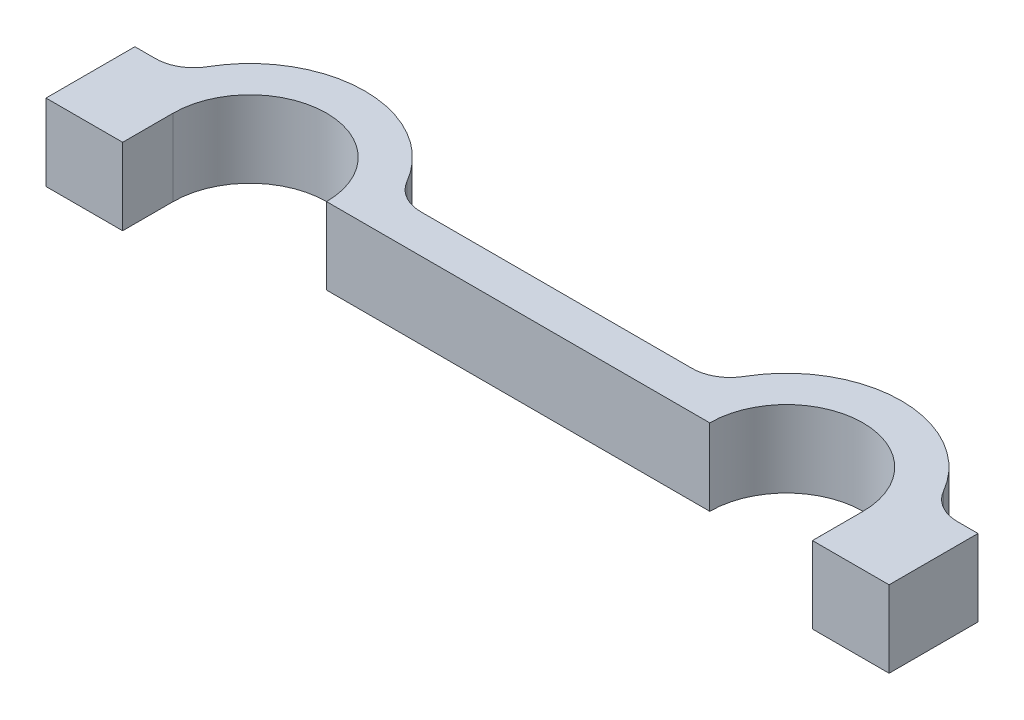
ISO-10303-21;
HEADER;
FILE_DESCRIPTION(('STEP AP214'),'2;1');
FILE_NAME('part.step','',(''),(''),'','','');
FILE_SCHEMA(('AUTOMOTIVE_DESIGN { 1 0 10303 214 1 1 1 1 }'));
ENDSEC;
DATA;
#1=APPLICATION_CONTEXT('core data for automotive mechanical design processes');
#2=APPLICATION_PROTOCOL_DEFINITION('international standard','automotive_design',2000,#1);
#3=PRODUCT_CONTEXT('',#1,'mechanical');
#4=PRODUCT('Part','Part','',(#3));
#5=PRODUCT_RELATED_PRODUCT_CATEGORY('part','',(#4));
#6=PRODUCT_DEFINITION_FORMATION('','',#4);
#7=PRODUCT_DEFINITION_CONTEXT('part definition',#1,'design');
#8=PRODUCT_DEFINITION('design','',#6,#7);
#9=PRODUCT_DEFINITION_SHAPE('','',#8);
#10=(LENGTH_UNIT() NAMED_UNIT(*) SI_UNIT(.MILLI.,.METRE.));
#11=(NAMED_UNIT(*) PLANE_ANGLE_UNIT() SI_UNIT($,.RADIAN.));
#12=(NAMED_UNIT(*) SI_UNIT($,.STERADIAN.) SOLID_ANGLE_UNIT());
#13=UNCERTAINTY_MEASURE_WITH_UNIT(LENGTH_MEASURE(1.E-05),#10,'distance_accuracy_value','');
#14=(GEOMETRIC_REPRESENTATION_CONTEXT(3) GLOBAL_UNCERTAINTY_ASSIGNED_CONTEXT((#13)) GLOBAL_UNIT_ASSIGNED_CONTEXT((#10,
#11,#12)) REPRESENTATION_CONTEXT('',''));
#15=CARTESIAN_POINT('',(0.,0.,0.));
#16=DIRECTION('',(0.,0.,1.));
#17=DIRECTION('',(1.,0.,0.));
#18=AXIS2_PLACEMENT_3D('',#15,#16,#17);
#19=CARTESIAN_POINT('',(12.7,12.7,0.));
#20=DIRECTION('',(0.,-1.,0.));
#21=DIRECTION('',(0.,0.,-1.));
#22=AXIS2_PLACEMENT_3D('',#19,#20,#21);
#23=CYLINDRICAL_SURFACE('',#22,12.7);
#24=CARTESIAN_POINT('',(12.7,0.,0.));
#25=DIRECTION('',(0.,-1.,0.));
#26=DIRECTION('',(0.,0.,-1.));
#27=AXIS2_PLACEMENT_3D('',#24,#25,#26);
#28=CIRCLE('',#27,12.7);
#29=CARTESIAN_POINT('',(0.,0.,0.));
#30=VERTEX_POINT('',#29);
#31=CARTESIAN_POINT('',(25.4,0.,0.));
#32=VERTEX_POINT('',#31);
#33=EDGE_CURVE('E178',#30,#32,#28,.T.);
#34=ORIENTED_EDGE('',*,*,#33,.T.);
#35=DIRECTION('',(0.,-1.,0.));
#36=VECTOR('',#35,1.);
#37=CARTESIAN_POINT('',(25.4,12.7,0.));
#38=LINE('',#37,#36);
#39=CARTESIAN_POINT('',(25.4,12.7,0.));
#40=VERTEX_POINT('',#39);
#41=EDGE_CURVE('E11',#40,#32,#38,.T.);
#42=ORIENTED_EDGE('',*,*,#41,.F.);
#43=CARTESIAN_POINT('',(12.7,12.7,0.));
#44=DIRECTION('',(0.,-1.,0.));
#45=DIRECTION('',(0.,0.,-1.));
#46=AXIS2_PLACEMENT_3D('',#43,#44,#45);
#47=CIRCLE('',#46,12.7);
#48=CARTESIAN_POINT('',(0.,12.7,0.));
#49=VERTEX_POINT('',#48);
#50=EDGE_CURVE('E56',#49,#40,#47,.T.);
#51=ORIENTED_EDGE('',*,*,#50,.F.);
#52=DIRECTION('',(0.,-1.,0.));
#53=VECTOR('',#52,1.);
#54=CARTESIAN_POINT('',(0.,12.7,0.));
#55=LINE('',#54,#53);
#56=EDGE_CURVE('E174',#49,#30,#55,.T.);
#57=ORIENTED_EDGE('',*,*,#56,.T.);
#58=EDGE_LOOP('',(#34,#42,#51,#57));
#59=FACE_BOUND('',#58,.T.);
#60=ADVANCED_FACE('F39',(#59),#23,.F.);
#61=CARTESIAN_POINT('',(25.4,12.7,0.));
#62=DIRECTION('',(0.,0.,-1.));
#63=DIRECTION('',(-1.,0.,0.));
#64=AXIS2_PLACEMENT_3D('',#61,#62,#63);
#65=PLANE('',#64);
#66=DIRECTION('',(1.,0.,0.));
#67=VECTOR('',#66,1.);
#68=CARTESIAN_POINT('',(25.4,0.,0.));
#69=LINE('',#68,#67);
#70=CARTESIAN_POINT('',(88.9,0.,0.));
#71=VERTEX_POINT('',#70);
#72=EDGE_CURVE('E182',#32,#71,#69,.T.);
#73=ORIENTED_EDGE('',*,*,#72,.T.);
#74=DIRECTION('',(0.,-1.,0.));
#75=VECTOR('',#74,1.);
#76=CARTESIAN_POINT('',(88.9,12.7,0.));
#77=LINE('',#76,#75);
#78=CARTESIAN_POINT('',(88.9,12.7,0.));
#79=VERTEX_POINT('',#78);
#80=EDGE_CURVE('E48',#79,#71,#77,.T.);
#81=ORIENTED_EDGE('',*,*,#80,.F.);
#82=DIRECTION('',(1.,0.,0.));
#83=VECTOR('',#82,1.);
#84=CARTESIAN_POINT('',(25.4,12.7,0.));
#85=LINE('',#84,#83);
#86=EDGE_CURVE('E117',#40,#79,#85,.T.);
#87=ORIENTED_EDGE('',*,*,#86,.F.);
#88=ORIENTED_EDGE('',*,*,#41,.T.);
#89=EDGE_LOOP('',(#73,#81,#87,#88));
#90=FACE_BOUND('',#89,.T.);
#91=ADVANCED_FACE('F379',(#90),#65,.F.);
#92=CARTESIAN_POINT('',(101.6,12.7,0.));
#93=DIRECTION('',(0.,-1.,0.));
#94=DIRECTION('',(0.,0.,-1.));
#95=AXIS2_PLACEMENT_3D('',#92,#93,#94);
#96=CYLINDRICAL_SURFACE('',#95,12.7);
#97=CARTESIAN_POINT('',(101.6,0.,0.));
#98=DIRECTION('',(0.,-1.,0.));
#99=DIRECTION('',(0.,0.,-1.));
#100=AXIS2_PLACEMENT_3D('',#97,#98,#99);
#101=CIRCLE('',#100,12.7);
#102=CARTESIAN_POINT('',(114.3,0.,0.));
#103=VERTEX_POINT('',#102);
#104=EDGE_CURVE('E186',#71,#103,#101,.T.);
#105=ORIENTED_EDGE('',*,*,#104,.T.);
#106=DIRECTION('',(0.,-1.,0.));
#107=VECTOR('',#106,1.);
#108=CARTESIAN_POINT('',(114.3,12.7,0.));
#109=LINE('',#108,#107);
#110=CARTESIAN_POINT('',(114.3,12.7,0.));
#111=VERTEX_POINT('',#110);
#112=EDGE_CURVE('E255',#111,#103,#109,.T.);
#113=ORIENTED_EDGE('',*,*,#112,.F.);
#114=CARTESIAN_POINT('',(101.6,12.7,0.));
#115=DIRECTION('',(0.,-1.,0.));
#116=DIRECTION('',(0.,0.,-1.));
#117=AXIS2_PLACEMENT_3D('',#114,#115,#116);
#118=CIRCLE('',#117,12.7);
#119=EDGE_CURVE('E266',#79,#111,#118,.T.);
#120=ORIENTED_EDGE('',*,*,#119,.F.);
#121=ORIENTED_EDGE('',*,*,#80,.T.);
#122=EDGE_LOOP('',(#105,#113,#120,#121));
#123=FACE_BOUND('',#122,.T.);
#124=ADVANCED_FACE('F263',(#123),#96,.F.);
#125=CARTESIAN_POINT('',(127.,12.7,0.));
#126=DIRECTION('',(-1.,0.,0.));
#127=DIRECTION('',(0.,0.,1.));
#128=AXIS2_PLACEMENT_3D('',#125,#126,#127);
#129=PLANE('',#128);
#130=DIRECTION('',(0.,0.,-1.));
#131=VECTOR('',#130,1.);
#132=CARTESIAN_POINT('',(127.,0.,0.));
#133=LINE('',#132,#131);
#134=CARTESIAN_POINT('',(127.,0.,8.382));
#135=VERTEX_POINT('',#134);
#136=CARTESIAN_POINT('',(127.,0.,-6.35));
#137=VERTEX_POINT('',#136);
#138=EDGE_CURVE('E189',#135,#137,#133,.T.);
#139=ORIENTED_EDGE('',*,*,#138,.T.);
#140=DIRECTION('',(0.,-1.,0.));
#141=VECTOR('',#140,1.);
#142=CARTESIAN_POINT('',(127.,12.7,-6.35));
#143=LINE('',#142,#141);
#144=CARTESIAN_POINT('',(127.,12.7,-6.35));
#145=VERTEX_POINT('',#144);
#146=EDGE_CURVE('E251',#145,#137,#143,.T.);
#147=ORIENTED_EDGE('',*,*,#146,.F.);
#148=DIRECTION('',(0.,0.,-1.));
#149=VECTOR('',#148,1.);
#150=CARTESIAN_POINT('',(127.,12.7,0.));
#151=LINE('',#150,#149);
#152=CARTESIAN_POINT('',(127.,12.7,8.382));
#153=VERTEX_POINT('',#152);
#154=EDGE_CURVE('E327',#153,#145,#151,.T.);
#155=ORIENTED_EDGE('',*,*,#154,.F.);
#156=DIRECTION('',(0.,1.,0.));
#157=VECTOR('',#156,1.);
#158=CARTESIAN_POINT('',(127.,0.,8.382));
#159=LINE('',#158,#157);
#160=EDGE_CURVE('E295',#135,#153,#159,.T.);
#161=ORIENTED_EDGE('',*,*,#160,.F.);
#162=EDGE_LOOP('',(#139,#147,#155,#161));
#163=FACE_BOUND('',#162,.T.);
#164=ADVANCED_FACE('F385',(#163),#129,.F.);
#165=CARTESIAN_POINT('',(123.597045256125,12.7,-6.35));
#166=DIRECTION('',(0.,0.,1.));
#167=DIRECTION('',(1.,0.,0.));
#168=AXIS2_PLACEMENT_3D('',#165,#166,#167);
#169=PLANE('',#168);
#170=DIRECTION('',(-1.,0.,0.));
#171=VECTOR('',#170,1.);
#172=CARTESIAN_POINT('',(123.597045256125,0.,-6.35));
#173=LINE('',#172,#171);
#174=CARTESIAN_POINT('',(123.597045256125,0.,-6.35));
#175=VERTEX_POINT('',#174);
#176=EDGE_CURVE('E192',#137,#175,#173,.T.);
#177=ORIENTED_EDGE('',*,*,#176,.T.);
#178=DIRECTION('',(0.,-1.,0.));
#179=VECTOR('',#178,1.);
#180=CARTESIAN_POINT('',(123.597045256125,12.7,-6.35));
#181=LINE('',#180,#179);
#182=CARTESIAN_POINT('',(123.597045256125,12.7,-6.35));
#183=VERTEX_POINT('',#182);
#184=EDGE_CURVE('E247',#183,#175,#181,.T.);
#185=ORIENTED_EDGE('',*,*,#184,.F.);
#186=DIRECTION('',(-1.,0.,0.));
#187=VECTOR('',#186,1.);
#188=CARTESIAN_POINT('',(123.597045256125,12.7,-6.35));
#189=LINE('',#188,#187);
#190=EDGE_CURVE('E330',#145,#183,#189,.T.);
#191=ORIENTED_EDGE('',*,*,#190,.F.);
#192=ORIENTED_EDGE('',*,*,#146,.T.);
#193=EDGE_LOOP('',(#177,#185,#191,#192));
#194=FACE_BOUND('',#193,.T.);
#195=ADVANCED_FACE('F390',(#194),#169,.F.);
#196=CARTESIAN_POINT('',(123.597045256125,12.7,-12.7));
#197=DIRECTION('',(0.,-1.,0.));
#198=DIRECTION('',(0.,0.,-1.));
#199=AXIS2_PLACEMENT_3D('',#196,#197,#198);
#200=CYLINDRICAL_SURFACE('',#199,6.35);
#201=CARTESIAN_POINT('',(123.597045256125,0.,-12.7));
#202=DIRECTION('',(0.,-1.,0.));
#203=DIRECTION('',(0.,0.,-1.));
#204=AXIS2_PLACEMENT_3D('',#201,#202,#203);
#205=CIRCLE('',#204,6.35);
#206=CARTESIAN_POINT('',(118.097783942094,0.,-9.52499999999999));
#207=VERTEX_POINT('',#206);
#208=EDGE_CURVE('E195',#175,#207,#205,.T.);
#209=ORIENTED_EDGE('',*,*,#208,.T.);
#210=DIRECTION('',(0.,-1.,0.));
#211=VECTOR('',#210,1.);
#212=CARTESIAN_POINT('',(118.097783942094,12.7,-9.52499999999999));
#213=LINE('',#212,#211);
#214=CARTESIAN_POINT('',(118.097783942094,12.7,-9.52499999999999));
#215=VERTEX_POINT('',#214);
#216=EDGE_CURVE('E243',#215,#207,#213,.T.);
#217=ORIENTED_EDGE('',*,*,#216,.F.);
#218=CARTESIAN_POINT('',(123.597045256125,12.7,-12.7));
#219=DIRECTION('',(0.,-1.,0.));
#220=DIRECTION('',(0.,0.,-1.));
#221=AXIS2_PLACEMENT_3D('',#218,#219,#220);
#222=CIRCLE('',#221,6.35);
#223=EDGE_CURVE('E333',#183,#215,#222,.T.);
#224=ORIENTED_EDGE('',*,*,#223,.F.);
#225=ORIENTED_EDGE('',*,*,#184,.T.);
#226=EDGE_LOOP('',(#209,#217,#224,#225));
#227=FACE_BOUND('',#226,.T.);
#228=ADVANCED_FACE('F394',(#227),#200,.F.);
#229=CARTESIAN_POINT('',(101.6,12.7,0.));
#230=DIRECTION('',(0.,-1.,0.));
#231=DIRECTION('',(0.,0.,-1.));
#232=AXIS2_PLACEMENT_3D('',#229,#230,#231);
#233=CYLINDRICAL_SURFACE('',#232,19.05);
#234=CARTESIAN_POINT('',(101.6,0.,0.));
#235=DIRECTION('',(0.,1.,0.));
#236=DIRECTION('',(0.,0.,-1.));
#237=AXIS2_PLACEMENT_3D('',#234,#235,#236);
#238=CIRCLE('',#237,19.05);
#239=CARTESIAN_POINT('',(85.1022160579064,0.,-9.525));
#240=VERTEX_POINT('',#239);
#241=EDGE_CURVE('E198',#207,#240,#238,.T.);
#242=ORIENTED_EDGE('',*,*,#241,.T.);
#243=DIRECTION('',(0.,-1.,0.));
#244=VECTOR('',#243,1.);
#245=CARTESIAN_POINT('',(85.1022160579064,12.7,-9.525));
#246=LINE('',#245,#244);
#247=CARTESIAN_POINT('',(85.1022160579064,12.7,-9.525));
#248=VERTEX_POINT('',#247);
#249=EDGE_CURVE('E239',#248,#240,#246,.T.);
#250=ORIENTED_EDGE('',*,*,#249,.F.);
#251=CARTESIAN_POINT('',(101.6,12.7,0.));
#252=DIRECTION('',(0.,1.,0.));
#253=DIRECTION('',(0.,0.,-1.));
#254=AXIS2_PLACEMENT_3D('',#251,#252,#253);
#255=CIRCLE('',#254,19.05);
#256=EDGE_CURVE('E336',#215,#248,#255,.T.);
#257=ORIENTED_EDGE('',*,*,#256,.F.);
#258=ORIENTED_EDGE('',*,*,#216,.T.);
#259=EDGE_LOOP('',(#242,#250,#257,#258));
#260=FACE_BOUND('',#259,.T.);
#261=ADVANCED_FACE('F398',(#260),#233,.T.);
#262=CARTESIAN_POINT('',(79.6029547438753,12.7,-12.7));
#263=DIRECTION('',(0.,-1.,0.));
#264=DIRECTION('',(0.,0.,-1.));
#265=AXIS2_PLACEMENT_3D('',#262,#263,#264);
#266=CYLINDRICAL_SURFACE('',#265,6.35);
#267=CARTESIAN_POINT('',(79.6029547438753,0.,-12.7));
#268=DIRECTION('',(0.,-1.,0.));
#269=DIRECTION('',(0.,0.,-1.));
#270=AXIS2_PLACEMENT_3D('',#267,#268,#269);
#271=CIRCLE('',#270,6.35);
#272=CARTESIAN_POINT('',(79.6029547438753,0.,-6.35));
#273=VERTEX_POINT('',#272);
#274=EDGE_CURVE('E201',#240,#273,#271,.T.);
#275=ORIENTED_EDGE('',*,*,#274,.T.);
#276=DIRECTION('',(0.,-1.,0.));
#277=VECTOR('',#276,1.);
#278=CARTESIAN_POINT('',(79.6029547438753,12.7,-6.35));
#279=LINE('',#278,#277);
#280=CARTESIAN_POINT('',(79.6029547438753,12.7,-6.35));
#281=VERTEX_POINT('',#280);
#282=EDGE_CURVE('E235',#281,#273,#279,.T.);
#283=ORIENTED_EDGE('',*,*,#282,.F.);
#284=CARTESIAN_POINT('',(79.6029547438753,12.7,-12.7));
#285=DIRECTION('',(0.,-1.,0.));
#286=DIRECTION('',(0.,0.,-1.));
#287=AXIS2_PLACEMENT_3D('',#284,#285,#286);
#288=CIRCLE('',#287,6.35);
#289=EDGE_CURVE('E339',#248,#281,#288,.T.);
#290=ORIENTED_EDGE('',*,*,#289,.F.);
#291=ORIENTED_EDGE('',*,*,#249,.T.);
#292=EDGE_LOOP('',(#275,#283,#290,#291));
#293=FACE_BOUND('',#292,.T.);
#294=ADVANCED_FACE('F402',(#293),#266,.F.);
#295=CARTESIAN_POINT('',(34.6970452561247,12.7,-6.35));
#296=DIRECTION('',(0.,0.,1.));
#297=DIRECTION('',(1.,0.,0.));
#298=AXIS2_PLACEMENT_3D('',#295,#296,#297);
#299=PLANE('',#298);
#300=DIRECTION('',(-1.,0.,0.));
#301=VECTOR('',#300,1.);
#302=CARTESIAN_POINT('',(34.6970452561247,0.,-6.35));
#303=LINE('',#302,#301);
#304=CARTESIAN_POINT('',(34.6970452561247,0.,-6.35));
#305=VERTEX_POINT('',#304);
#306=EDGE_CURVE('E204',#273,#305,#303,.T.);
#307=ORIENTED_EDGE('',*,*,#306,.T.);
#308=DIRECTION('',(0.,-1.,0.));
#309=VECTOR('',#308,1.);
#310=CARTESIAN_POINT('',(34.6970452561247,12.7,-6.35));
#311=LINE('',#310,#309);
#312=CARTESIAN_POINT('',(34.6970452561247,12.7,-6.35));
#313=VERTEX_POINT('',#312);
#314=EDGE_CURVE('E231',#313,#305,#311,.T.);
#315=ORIENTED_EDGE('',*,*,#314,.F.);
#316=DIRECTION('',(-1.,0.,0.));
#317=VECTOR('',#316,1.);
#318=CARTESIAN_POINT('',(34.6970452561247,12.7,-6.35));
#319=LINE('',#318,#317);
#320=EDGE_CURVE('E342',#281,#313,#319,.T.);
#321=ORIENTED_EDGE('',*,*,#320,.F.);
#322=ORIENTED_EDGE('',*,*,#282,.T.);
#323=EDGE_LOOP('',(#307,#315,#321,#322));
#324=FACE_BOUND('',#323,.T.);
#325=ADVANCED_FACE('F406',(#324),#299,.F.);
#326=CARTESIAN_POINT('',(34.6970452561247,12.7,-12.7));
#327=DIRECTION('',(0.,-1.,0.));
#328=DIRECTION('',(0.,0.,-1.));
#329=AXIS2_PLACEMENT_3D('',#326,#327,#328);
#330=CYLINDRICAL_SURFACE('',#329,6.35);
#331=CARTESIAN_POINT('',(34.6970452561247,0.,-12.7));
#332=DIRECTION('',(0.,-1.,0.));
#333=DIRECTION('',(0.,0.,-1.));
#334=AXIS2_PLACEMENT_3D('',#331,#332,#333);
#335=CIRCLE('',#334,6.35);
#336=CARTESIAN_POINT('',(29.1977839420936,0.,-9.52500000000001));
#337=VERTEX_POINT('',#336);
#338=EDGE_CURVE('E207',#305,#337,#335,.T.);
#339=ORIENTED_EDGE('',*,*,#338,.T.);
#340=DIRECTION('',(0.,-1.,0.));
#341=VECTOR('',#340,1.);
#342=CARTESIAN_POINT('',(29.1977839420936,12.7,-9.52500000000001));
#343=LINE('',#342,#341);
#344=CARTESIAN_POINT('',(29.1977839420936,12.7,-9.52500000000001));
#345=VERTEX_POINT('',#344);
#346=EDGE_CURVE('E227',#345,#337,#343,.T.);
#347=ORIENTED_EDGE('',*,*,#346,.F.);
#348=CARTESIAN_POINT('',(34.6970452561247,12.7,-12.7));
#349=DIRECTION('',(0.,-1.,0.));
#350=DIRECTION('',(0.,0.,-1.));
#351=AXIS2_PLACEMENT_3D('',#348,#349,#350);
#352=CIRCLE('',#351,6.35);
#353=EDGE_CURVE('E345',#313,#345,#352,.T.);
#354=ORIENTED_EDGE('',*,*,#353,.F.);
#355=ORIENTED_EDGE('',*,*,#314,.T.);
#356=EDGE_LOOP('',(#339,#347,#354,#355));
#357=FACE_BOUND('',#356,.T.);
#358=ADVANCED_FACE('F353',(#357),#330,.F.);
#359=CARTESIAN_POINT('',(12.7,12.7,0.));
#360=DIRECTION('',(0.,-1.,0.));
#361=DIRECTION('',(0.,0.,-1.));
#362=AXIS2_PLACEMENT_3D('',#359,#360,#361);
#363=CYLINDRICAL_SURFACE('',#362,19.05);
#364=CARTESIAN_POINT('',(12.7,0.,0.));
#365=DIRECTION('',(0.,1.,0.));
#366=DIRECTION('',(0.,0.,-1.));
#367=AXIS2_PLACEMENT_3D('',#364,#365,#366);
#368=CIRCLE('',#367,19.05);
#369=CARTESIAN_POINT('',(-3.79778394209355,0.,-9.525));
#370=VERTEX_POINT('',#369);
#371=EDGE_CURVE('E210',#337,#370,#368,.T.);
#372=ORIENTED_EDGE('',*,*,#371,.T.);
#373=DIRECTION('',(0.,-1.,0.));
#374=VECTOR('',#373,1.);
#375=CARTESIAN_POINT('',(-3.79778394209355,12.7,-9.525));
#376=LINE('',#375,#374);
#377=CARTESIAN_POINT('',(-3.79778394209355,12.7,-9.525));
#378=VERTEX_POINT('',#377);
#379=EDGE_CURVE('E165',#378,#370,#376,.T.);
#380=ORIENTED_EDGE('',*,*,#379,.F.);
#381=CARTESIAN_POINT('',(12.7,12.7,0.));
#382=DIRECTION('',(0.,1.,0.));
#383=DIRECTION('',(0.,0.,-1.));
#384=AXIS2_PLACEMENT_3D('',#381,#382,#383);
#385=CIRCLE('',#384,19.05);
#386=EDGE_CURVE('E158',#345,#378,#385,.T.);
#387=ORIENTED_EDGE('',*,*,#386,.F.);
#388=ORIENTED_EDGE('',*,*,#346,.T.);
#389=EDGE_LOOP('',(#372,#380,#387,#388));
#390=FACE_BOUND('',#389,.T.);
#391=ADVANCED_FACE('F357',(#390),#363,.T.);
#392=CARTESIAN_POINT('',(-9.29704525612474,12.7,-12.7));
#393=DIRECTION('',(0.,-1.,0.));
#394=DIRECTION('',(0.,0.,-1.));
#395=AXIS2_PLACEMENT_3D('',#392,#393,#394);
#396=CYLINDRICAL_SURFACE('',#395,6.35);
#397=CARTESIAN_POINT('',(-9.29704525612474,0.,-12.7));
#398=DIRECTION('',(0.,-1.,0.));
#399=DIRECTION('',(0.,0.,-1.));
#400=AXIS2_PLACEMENT_3D('',#397,#398,#399);
#401=CIRCLE('',#400,6.35);
#402=CARTESIAN_POINT('',(-9.29704525612474,0.,-6.35));
#403=VERTEX_POINT('',#402);
#404=EDGE_CURVE('E102',#370,#403,#401,.T.);
#405=ORIENTED_EDGE('',*,*,#404,.T.);
#406=DIRECTION('',(0.,-1.,0.));
#407=VECTOR('',#406,1.);
#408=CARTESIAN_POINT('',(-9.29704525612474,12.7,-6.35));
#409=LINE('',#408,#407);
#410=CARTESIAN_POINT('',(-9.29704525612474,12.7,-6.35));
#411=VERTEX_POINT('',#410);
#412=EDGE_CURVE('E162',#411,#403,#409,.T.);
#413=ORIENTED_EDGE('',*,*,#412,.F.);
#414=CARTESIAN_POINT('',(-9.29704525612474,12.7,-12.7));
#415=DIRECTION('',(0.,-1.,0.));
#416=DIRECTION('',(0.,0.,-1.));
#417=AXIS2_PLACEMENT_3D('',#414,#415,#416);
#418=CIRCLE('',#417,6.35);
#419=EDGE_CURVE('E152',#378,#411,#418,.T.);
#420=ORIENTED_EDGE('',*,*,#419,.F.);
#421=ORIENTED_EDGE('',*,*,#379,.T.);
#422=EDGE_LOOP('',(#405,#413,#420,#421));
#423=FACE_BOUND('',#422,.T.);
#424=ADVANCED_FACE('F163',(#423),#396,.F.);
#425=CARTESIAN_POINT('',(-9.29704525612474,12.7,-6.35));
#426=DIRECTION('',(0.,0.,1.));
#427=DIRECTION('',(1.,0.,0.));
#428=AXIS2_PLACEMENT_3D('',#425,#426,#427);
#429=PLANE('',#428);
#430=DIRECTION('',(-1.,0.,0.));
#431=VECTOR('',#430,1.);
#432=CARTESIAN_POINT('',(-9.29704525612474,0.,-6.35));
#433=LINE('',#432,#431);
#434=CARTESIAN_POINT('',(-12.7,0.,-6.35));
#435=VERTEX_POINT('',#434);
#436=EDGE_CURVE('E109',#403,#435,#433,.T.);
#437=ORIENTED_EDGE('',*,*,#436,.T.);
#438=DIRECTION('',(0.,-1.,0.));
#439=VECTOR('',#438,1.);
#440=CARTESIAN_POINT('',(-12.7,12.7,-6.35));
#441=LINE('',#440,#439);
#442=CARTESIAN_POINT('',(-12.7,12.7,-6.35));
#443=VERTEX_POINT('',#442);
#444=EDGE_CURVE('E166',#443,#435,#441,.T.);
#445=ORIENTED_EDGE('',*,*,#444,.F.);
#446=DIRECTION('',(-1.,0.,0.));
#447=VECTOR('',#446,1.);
#448=CARTESIAN_POINT('',(-9.29704525612474,12.7,-6.35));
#449=LINE('',#448,#447);
#450=EDGE_CURVE('E156',#411,#443,#449,.T.);
#451=ORIENTED_EDGE('',*,*,#450,.F.);
#452=ORIENTED_EDGE('',*,*,#412,.T.);
#453=EDGE_LOOP('',(#437,#445,#451,#452));
#454=FACE_BOUND('',#453,.T.);
#455=ADVANCED_FACE('F168',(#454),#429,.F.);
#456=CARTESIAN_POINT('',(-12.7,12.7,0.));
#457=DIRECTION('',(1.,0.,0.));
#458=DIRECTION('',(0.,0.,-1.));
#459=AXIS2_PLACEMENT_3D('',#456,#457,#458);
#460=PLANE('',#459);
#461=DIRECTION('',(0.,0.,1.));
#462=VECTOR('',#461,1.);
#463=CARTESIAN_POINT('',(-12.7,0.,0.));
#464=LINE('',#463,#462);
#465=CARTESIAN_POINT('',(-12.7,0.,8.382));
#466=VERTEX_POINT('',#465);
#467=EDGE_CURVE('E217',#435,#466,#464,.T.);
#468=ORIENTED_EDGE('',*,*,#467,.T.);
#469=DIRECTION('',(0.,-1.,0.));
#470=VECTOR('',#469,1.);
#471=CARTESIAN_POINT('',(-12.7,0.,8.382));
#472=LINE('',#471,#470);
#473=CARTESIAN_POINT('',(-12.7,12.7,8.382));
#474=VERTEX_POINT('',#473);
#475=EDGE_CURVE('E281',#474,#466,#472,.T.);
#476=ORIENTED_EDGE('',*,*,#475,.F.);
#477=DIRECTION('',(0.,0.,1.));
#478=VECTOR('',#477,1.);
#479=CARTESIAN_POINT('',(-12.7,12.7,0.));
#480=LINE('',#479,#478);
#481=EDGE_CURVE('E171',#443,#474,#480,.T.);
#482=ORIENTED_EDGE('',*,*,#481,.F.);
#483=ORIENTED_EDGE('',*,*,#444,.T.);
#484=EDGE_LOOP('',(#468,#476,#482,#483));
#485=FACE_BOUND('',#484,.T.);
#486=ADVANCED_FACE('F364',(#485),#460,.F.);
#487=CARTESIAN_POINT('',(12.7,12.7,0.));
#488=DIRECTION('',(0.,-1.,0.));
#489=DIRECTION('',(0.,0.,-1.));
#490=AXIS2_PLACEMENT_3D('',#487,#488,#489);
#491=PLANE('',#490);
#492=ORIENTED_EDGE('',*,*,#50,.T.);
#493=ORIENTED_EDGE('',*,*,#86,.T.);
#494=ORIENTED_EDGE('',*,*,#119,.T.);
#495=DIRECTION('',(0.,0.,-1.));
#496=VECTOR('',#495,1.);
#497=CARTESIAN_POINT('',(114.3,12.7,8.382));
#498=LINE('',#497,#496);
#499=CARTESIAN_POINT('',(114.3,12.7,8.382));
#500=VERTEX_POINT('',#499);
#501=EDGE_CURVE('E282',#500,#111,#498,.T.);
#502=ORIENTED_EDGE('',*,*,#501,.F.);
#503=DIRECTION('',(-1.,0.,0.));
#504=VECTOR('',#503,1.);
#505=CARTESIAN_POINT('',(114.3,12.7,8.382));
#506=LINE('',#505,#504);
#507=EDGE_CURVE('E291',#153,#500,#506,.T.);
#508=ORIENTED_EDGE('',*,*,#507,.F.);
#509=ORIENTED_EDGE('',*,*,#154,.T.);
#510=ORIENTED_EDGE('',*,*,#190,.T.);
#511=ORIENTED_EDGE('',*,*,#223,.T.);
#512=ORIENTED_EDGE('',*,*,#256,.T.);
#513=ORIENTED_EDGE('',*,*,#289,.T.);
#514=ORIENTED_EDGE('',*,*,#320,.T.);
#515=ORIENTED_EDGE('',*,*,#353,.T.);
#516=ORIENTED_EDGE('',*,*,#386,.T.);
#517=ORIENTED_EDGE('',*,*,#419,.T.);
#518=ORIENTED_EDGE('',*,*,#450,.T.);
#519=ORIENTED_EDGE('',*,*,#481,.T.);
#520=DIRECTION('',(-1.,0.,0.));
#521=VECTOR('',#520,1.);
#522=CARTESIAN_POINT('',(-12.7,12.7,8.382));
#523=LINE('',#522,#521);
#524=CARTESIAN_POINT('',(0.,12.7,8.382));
#525=VERTEX_POINT('',#524);
#526=EDGE_CURVE('E310',#525,#474,#523,.T.);
#527=ORIENTED_EDGE('',*,*,#526,.F.);
#528=DIRECTION('',(0.,0.,-1.));
#529=VECTOR('',#528,1.);
#530=CARTESIAN_POINT('',(0.,12.7,8.382));
#531=LINE('',#530,#529);
#532=EDGE_CURVE('E314',#525,#49,#531,.T.);
#533=ORIENTED_EDGE('',*,*,#532,.T.);
#534=EDGE_LOOP('',(#492,#493,#494,#502,#508,#509,#510,#511,#512,#513,#514,#515,#516,#517,#518,
#519,#527,#533));
#535=FACE_BOUND('',#534,.T.);
#536=ADVANCED_FACE('F153',(#535),#491,.F.);
#537=CARTESIAN_POINT('',(12.7,0.,0.));
#538=DIRECTION('',(0.,-1.,0.));
#539=DIRECTION('',(0.,0.,-1.));
#540=AXIS2_PLACEMENT_3D('',#537,#538,#539);
#541=PLANE('',#540);
#542=ORIENTED_EDGE('',*,*,#33,.F.);
#543=DIRECTION('',(0.,0.,-1.));
#544=VECTOR('',#543,1.);
#545=CARTESIAN_POINT('',(0.,0.,8.382));
#546=LINE('',#545,#544);
#547=CARTESIAN_POINT('',(0.,0.,8.382));
#548=VERTEX_POINT('',#547);
#549=EDGE_CURVE('E183',#548,#30,#546,.T.);
#550=ORIENTED_EDGE('',*,*,#549,.F.);
#551=DIRECTION('',(1.,0.,0.));
#552=VECTOR('',#551,1.);
#553=CARTESIAN_POINT('',(-12.7,0.,8.382));
#554=LINE('',#553,#552);
#555=EDGE_CURVE('E302',#466,#548,#554,.T.);
#556=ORIENTED_EDGE('',*,*,#555,.F.);
#557=ORIENTED_EDGE('',*,*,#467,.F.);
#558=ORIENTED_EDGE('',*,*,#436,.F.);
#559=ORIENTED_EDGE('',*,*,#404,.F.);
#560=ORIENTED_EDGE('',*,*,#371,.F.);
#561=ORIENTED_EDGE('',*,*,#338,.F.);
#562=ORIENTED_EDGE('',*,*,#306,.F.);
#563=ORIENTED_EDGE('',*,*,#274,.F.);
#564=ORIENTED_EDGE('',*,*,#241,.F.);
#565=ORIENTED_EDGE('',*,*,#208,.F.);
#566=ORIENTED_EDGE('',*,*,#176,.F.);
#567=ORIENTED_EDGE('',*,*,#138,.F.);
#568=DIRECTION('',(1.,0.,0.));
#569=VECTOR('',#568,1.);
#570=CARTESIAN_POINT('',(114.3,0.,8.382));
#571=LINE('',#570,#569);
#572=CARTESIAN_POINT('',(114.3,0.,8.382));
#573=VERTEX_POINT('',#572);
#574=EDGE_CURVE('E276',#573,#135,#571,.T.);
#575=ORIENTED_EDGE('',*,*,#574,.F.);
#576=DIRECTION('',(0.,0.,-1.));
#577=VECTOR('',#576,1.);
#578=CARTESIAN_POINT('',(114.3,0.,8.382));
#579=LINE('',#578,#577);
#580=EDGE_CURVE('E272',#573,#103,#579,.T.);
#581=ORIENTED_EDGE('',*,*,#580,.T.);
#582=ORIENTED_EDGE('',*,*,#104,.F.);
#583=ORIENTED_EDGE('',*,*,#72,.F.);
#584=EDGE_LOOP('',(#542,#550,#556,#557,#558,#559,#560,#561,#562,#563,#564,#565,#566,#567,#575,
#581,#582,#583));
#585=FACE_BOUND('',#584,.T.);
#586=ADVANCED_FACE('F269',(#585),#541,.T.);
#587=CARTESIAN_POINT('',(0.,0.,8.382));
#588=DIRECTION('',(-1.,0.,0.));
#589=DIRECTION('',(0.,0.,1.));
#590=AXIS2_PLACEMENT_3D('',#587,#588,#589);
#591=PLANE('',#590);
#592=ORIENTED_EDGE('',*,*,#56,.F.);
#593=ORIENTED_EDGE('',*,*,#532,.F.);
#594=DIRECTION('',(0.,1.,0.));
#595=VECTOR('',#594,1.);
#596=CARTESIAN_POINT('',(0.,0.,8.382));
#597=LINE('',#596,#595);
#598=EDGE_CURVE('E306',#548,#525,#597,.T.);
#599=ORIENTED_EDGE('',*,*,#598,.F.);
#600=ORIENTED_EDGE('',*,*,#549,.T.);
#601=EDGE_LOOP('',(#592,#593,#599,#600));
#602=FACE_BOUND('',#601,.T.);
#603=ADVANCED_FACE('F378',(#602),#591,.F.);
#604=CARTESIAN_POINT('',(0.,0.,8.382));
#605=DIRECTION('',(0.,0.,-1.));
#606=DIRECTION('',(-1.,0.,0.));
#607=AXIS2_PLACEMENT_3D('',#604,#605,#606);
#608=PLANE('',#607);
#609=ORIENTED_EDGE('',*,*,#475,.T.);
#610=ORIENTED_EDGE('',*,*,#555,.T.);
#611=ORIENTED_EDGE('',*,*,#598,.T.);
#612=ORIENTED_EDGE('',*,*,#526,.T.);
#613=EDGE_LOOP('',(#609,#610,#611,#612));
#614=FACE_BOUND('',#613,.T.);
#615=ADVANCED_FACE('F374',(#614),#608,.F.);
#616=CARTESIAN_POINT('',(114.3,0.,8.382));
#617=DIRECTION('',(1.,0.,0.));
#618=DIRECTION('',(0.,0.,-1.));
#619=AXIS2_PLACEMENT_3D('',#616,#617,#618);
#620=PLANE('',#619);
#621=ORIENTED_EDGE('',*,*,#112,.T.);
#622=ORIENTED_EDGE('',*,*,#580,.F.);
#623=DIRECTION('',(0.,-1.,0.));
#624=VECTOR('',#623,1.);
#625=CARTESIAN_POINT('',(114.3,0.,8.382));
#626=LINE('',#625,#624);
#627=EDGE_CURVE('E288',#500,#573,#626,.T.);
#628=ORIENTED_EDGE('',*,*,#627,.F.);
#629=ORIENTED_EDGE('',*,*,#501,.T.);
#630=EDGE_LOOP('',(#621,#622,#628,#629));
#631=FACE_BOUND('',#630,.T.);
#632=ADVANCED_FACE('F285',(#631),#620,.F.);
#633=CARTESIAN_POINT('',(0.,0.,8.382));
#634=DIRECTION('',(0.,0.,-1.));
#635=DIRECTION('',(-1.,0.,0.));
#636=AXIS2_PLACEMENT_3D('',#633,#634,#635);
#637=PLANE('',#636);
#638=ORIENTED_EDGE('',*,*,#627,.T.);
#639=ORIENTED_EDGE('',*,*,#574,.T.);
#640=ORIENTED_EDGE('',*,*,#160,.T.);
#641=ORIENTED_EDGE('',*,*,#507,.T.);
#642=EDGE_LOOP('',(#638,#639,#640,#641));
#643=FACE_BOUND('',#642,.T.);
#644=ADVANCED_FACE('F431',(#643),#637,.F.);
#645=CLOSED_SHELL('',(#60,#91,#124,#164,#195,#228,#261,#294,#325,#358,#391,#424,#455,#486,#536,
#586,#603,#615,#632,#644));
#646=MANIFOLD_SOLID_BREP('B2',#645);
#647=ADVANCED_BREP_SHAPE_REPRESENTATION('',(#18,#646),#14);
#648=SHAPE_DEFINITION_REPRESENTATION(#9,#647);
ENDSEC;
END-ISO-10303-21;
